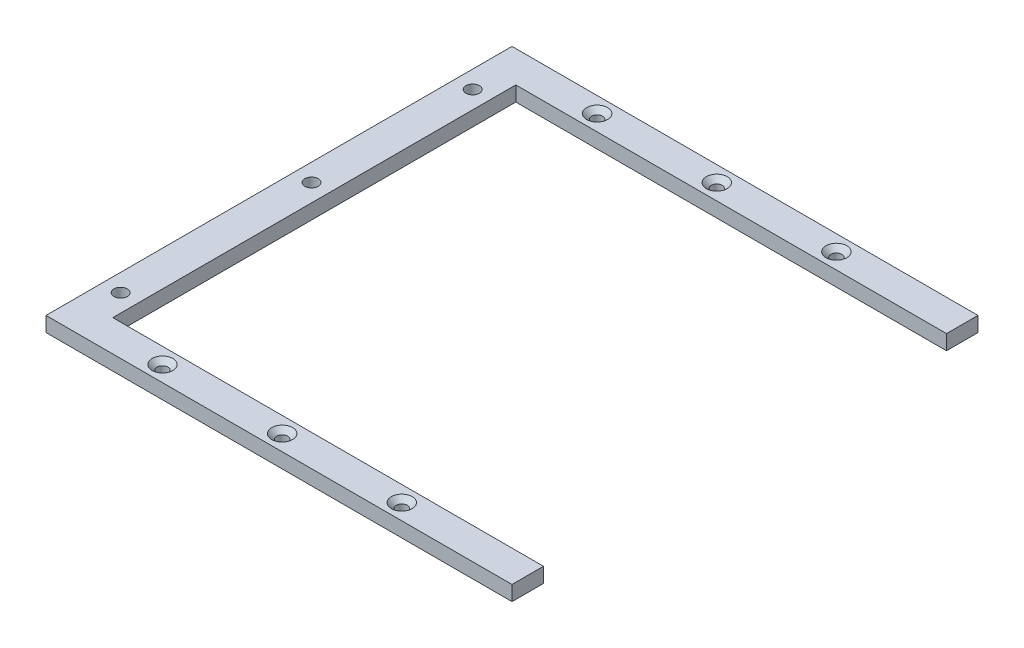
ISO-10303-21;
HEADER;
FILE_DESCRIPTION(('STEP AP214'),'2;1');
FILE_NAME('part.step','',(''),(''),'','','');
FILE_SCHEMA(('AUTOMOTIVE_DESIGN { 1 0 10303 214 1 1 1 1 }'));
ENDSEC;
DATA;
#1=APPLICATION_CONTEXT('core data for automotive mechanical design processes');
#2=APPLICATION_PROTOCOL_DEFINITION('international standard','automotive_design',2000,#1);
#3=PRODUCT_CONTEXT('',#1,'mechanical');
#4=PRODUCT('Part','Part','',(#3));
#5=PRODUCT_RELATED_PRODUCT_CATEGORY('part','',(#4));
#6=PRODUCT_DEFINITION_FORMATION('','',#4);
#7=PRODUCT_DEFINITION_CONTEXT('part definition',#1,'design');
#8=PRODUCT_DEFINITION('design','',#6,#7);
#9=PRODUCT_DEFINITION_SHAPE('','',#8);
#10=(LENGTH_UNIT() NAMED_UNIT(*) SI_UNIT(.MILLI.,.METRE.));
#11=(NAMED_UNIT(*) PLANE_ANGLE_UNIT() SI_UNIT($,.RADIAN.));
#12=(NAMED_UNIT(*) SI_UNIT($,.STERADIAN.) SOLID_ANGLE_UNIT());
#13=UNCERTAINTY_MEASURE_WITH_UNIT(LENGTH_MEASURE(1.E-05),#10,'distance_accuracy_value','');
#14=(GEOMETRIC_REPRESENTATION_CONTEXT(3) GLOBAL_UNCERTAINTY_ASSIGNED_CONTEXT((#13)) GLOBAL_UNIT_ASSIGNED_CONTEXT((#10,
#11,#12)) REPRESENTATION_CONTEXT('',''));
#15=CARTESIAN_POINT('',(0.,0.,0.));
#16=DIRECTION('',(0.,0.,1.));
#17=DIRECTION('',(1.,0.,0.));
#18=AXIS2_PLACEMENT_3D('',#15,#16,#17);
#19=CARTESIAN_POINT('',(0.,3.,0.));
#20=DIRECTION('',(1.,0.,0.));
#21=DIRECTION('',(0.,0.,-1.));
#22=AXIS2_PLACEMENT_3D('',#19,#20,#21);
#23=PLANE('',#22);
#24=DIRECTION('',(0.,0.,1.));
#25=VECTOR('',#24,1.);
#26=CARTESIAN_POINT('',(0.,0.,0.));
#27=LINE('',#26,#25);
#28=CARTESIAN_POINT('',(0.,0.,0.));
#29=VERTEX_POINT('',#28);
#30=CARTESIAN_POINT('',(0.,0.,93.9800000000001));
#31=VERTEX_POINT('',#30);
#32=EDGE_CURVE('E165',#29,#31,#27,.T.);
#33=ORIENTED_EDGE('',*,*,#32,.T.);
#34=DIRECTION('',(0.,-1.,0.));
#35=VECTOR('',#34,1.);
#36=CARTESIAN_POINT('',(0.,3.,93.9800000000001));
#37=LINE('',#36,#35);
#38=CARTESIAN_POINT('',(0.,3.,93.9800000000001));
#39=VERTEX_POINT('',#38);
#40=EDGE_CURVE('E232',#39,#31,#37,.T.);
#41=ORIENTED_EDGE('',*,*,#40,.F.);
#42=DIRECTION('',(0.,0.,1.));
#43=VECTOR('',#42,1.);
#44=CARTESIAN_POINT('',(0.,3.,0.));
#45=LINE('',#44,#43);
#46=CARTESIAN_POINT('',(0.,3.,0.));
#47=VERTEX_POINT('',#46);
#48=EDGE_CURVE('E424',#47,#39,#45,.T.);
#49=ORIENTED_EDGE('',*,*,#48,.F.);
#50=DIRECTION('',(0.,-1.,0.));
#51=VECTOR('',#50,1.);
#52=CARTESIAN_POINT('',(0.,3.,0.));
#53=LINE('',#52,#51);
#54=EDGE_CURVE('E66',#47,#29,#53,.T.);
#55=ORIENTED_EDGE('',*,*,#54,.T.);
#56=EDGE_LOOP('',(#33,#41,#49,#55));
#57=FACE_BOUND('',#56,.T.);
#58=ADVANCED_FACE('F47',(#57),#23,.F.);
#59=CARTESIAN_POINT('',(0.,3.,93.9800000000001));
#60=DIRECTION('',(0.,0.,-1.));
#61=DIRECTION('',(-1.,0.,0.));
#62=AXIS2_PLACEMENT_3D('',#59,#60,#61);
#63=PLANE('',#62);
#64=DIRECTION('',(1.,0.,0.));
#65=VECTOR('',#64,1.);
#66=CARTESIAN_POINT('',(0.,0.,93.9800000000001));
#67=LINE('',#66,#65);
#68=CARTESIAN_POINT('',(93.98,0.,93.9800000000001));
#69=VERTEX_POINT('',#68);
#70=EDGE_CURVE('E168',#31,#69,#67,.T.);
#71=ORIENTED_EDGE('',*,*,#70,.T.);
#72=DIRECTION('',(0.,-1.,0.));
#73=VECTOR('',#72,1.);
#74=CARTESIAN_POINT('',(93.98,3.,93.9800000000001));
#75=LINE('',#74,#73);
#76=CARTESIAN_POINT('',(93.98,3.,93.9800000000001));
#77=VERTEX_POINT('',#76);
#78=EDGE_CURVE('E228',#77,#69,#75,.T.);
#79=ORIENTED_EDGE('',*,*,#78,.F.);
#80=DIRECTION('',(1.,0.,0.));
#81=VECTOR('',#80,1.);
#82=CARTESIAN_POINT('',(0.,3.,93.9800000000001));
#83=LINE('',#82,#81);
#84=EDGE_CURVE('E105',#39,#77,#83,.T.);
#85=ORIENTED_EDGE('',*,*,#84,.F.);
#86=ORIENTED_EDGE('',*,*,#40,.T.);
#87=EDGE_LOOP('',(#71,#79,#85,#86));
#88=FACE_BOUND('',#87,.T.);
#89=ADVANCED_FACE('F296',(#88),#63,.F.);
#90=CARTESIAN_POINT('',(93.98,3.,0.));
#91=DIRECTION('',(-1.,0.,0.));
#92=DIRECTION('',(0.,0.,1.));
#93=AXIS2_PLACEMENT_3D('',#90,#91,#92);
#94=PLANE('',#93);
#95=DIRECTION('',(0.,0.,-1.));
#96=VECTOR('',#95,1.);
#97=CARTESIAN_POINT('',(93.98,0.,0.));
#98=LINE('',#97,#96);
#99=CARTESIAN_POINT('',(93.98,0.,87.6300000000001));
#100=VERTEX_POINT('',#99);
#101=EDGE_CURVE('E171',#69,#100,#98,.T.);
#102=ORIENTED_EDGE('',*,*,#101,.T.);
#103=DIRECTION('',(0.,-1.,0.));
#104=VECTOR('',#103,1.);
#105=CARTESIAN_POINT('',(93.98,3.,87.6300000000001));
#106=LINE('',#105,#104);
#107=CARTESIAN_POINT('',(93.98,3.,87.6300000000001));
#108=VERTEX_POINT('',#107);
#109=EDGE_CURVE('E225',#108,#100,#106,.T.);
#110=ORIENTED_EDGE('',*,*,#109,.F.);
#111=DIRECTION('',(0.,0.,-1.));
#112=VECTOR('',#111,1.);
#113=CARTESIAN_POINT('',(93.98,3.,0.));
#114=LINE('',#113,#112);
#115=EDGE_CURVE('E416',#77,#108,#114,.T.);
#116=ORIENTED_EDGE('',*,*,#115,.F.);
#117=ORIENTED_EDGE('',*,*,#78,.T.);
#118=EDGE_LOOP('',(#102,#110,#116,#117));
#119=FACE_BOUND('',#118,.T.);
#120=ADVANCED_FACE('F301',(#119),#94,.F.);
#121=CARTESIAN_POINT('',(0.,3.,87.6300000000002));
#122=DIRECTION('',(0.,0.,-1.));
#123=DIRECTION('',(-1.,0.,0.));
#124=AXIS2_PLACEMENT_3D('',#121,#122,#123);
#125=PLANE('',#124);
#126=DIRECTION('',(1.,0.,0.));
#127=VECTOR('',#126,1.);
#128=CARTESIAN_POINT('',(0.,0.,87.6300000000002));
#129=LINE('',#128,#127);
#130=CARTESIAN_POINT('',(7.11998400000002,0.,87.6300000000002));
#131=VERTEX_POINT('',#130);
#132=EDGE_CURVE('E175',#131,#100,#129,.T.);
#133=ORIENTED_EDGE('',*,*,#132,.F.);
#134=DIRECTION('',(0.,-1.,0.));
#135=VECTOR('',#134,1.);
#136=CARTESIAN_POINT('',(7.11998400000002,3.,87.6300000000002));
#137=LINE('',#136,#135);
#138=CARTESIAN_POINT('',(7.11998400000002,3.,87.6300000000002));
#139=VERTEX_POINT('',#138);
#140=EDGE_CURVE('E222',#139,#131,#137,.T.);
#141=ORIENTED_EDGE('',*,*,#140,.F.);
#142=DIRECTION('',(1.,0.,0.));
#143=VECTOR('',#142,1.);
#144=CARTESIAN_POINT('',(0.,3.,87.6300000000002));
#145=LINE('',#144,#143);
#146=EDGE_CURVE('E414',#139,#108,#145,.T.);
#147=ORIENTED_EDGE('',*,*,#146,.T.);
#148=ORIENTED_EDGE('',*,*,#109,.T.);
#149=EDGE_LOOP('',(#133,#141,#147,#148));
#150=FACE_BOUND('',#149,.T.);
#151=ADVANCED_FACE('F398',(#150),#125,.T.);
#152=CARTESIAN_POINT('',(7.11998399999999,3.,0.));
#153=DIRECTION('',(-1.,0.,0.));
#154=DIRECTION('',(0.,0.,1.));
#155=AXIS2_PLACEMENT_3D('',#152,#153,#154);
#156=PLANE('',#155);
#157=DIRECTION('',(0.,0.,-1.));
#158=VECTOR('',#157,1.);
#159=CARTESIAN_POINT('',(7.11998399999999,0.,0.));
#160=LINE('',#159,#158);
#161=CARTESIAN_POINT('',(7.11998399999999,0.,6.34999999999995));
#162=VERTEX_POINT('',#161);
#163=EDGE_CURVE('E179',#131,#162,#160,.T.);
#164=ORIENTED_EDGE('',*,*,#163,.T.);
#165=DIRECTION('',(0.,-1.,0.));
#166=VECTOR('',#165,1.);
#167=CARTESIAN_POINT('',(7.11998399999999,3.,6.34999999999995));
#168=LINE('',#167,#166);
#169=CARTESIAN_POINT('',(7.11998399999999,3.,6.34999999999995));
#170=VERTEX_POINT('',#169);
#171=EDGE_CURVE('E143',#170,#162,#168,.T.);
#172=ORIENTED_EDGE('',*,*,#171,.F.);
#173=DIRECTION('',(0.,0.,-1.));
#174=VECTOR('',#173,1.);
#175=CARTESIAN_POINT('',(7.11998399999999,3.,0.));
#176=LINE('',#175,#174);
#177=EDGE_CURVE('E129',#139,#170,#176,.T.);
#178=ORIENTED_EDGE('',*,*,#177,.F.);
#179=ORIENTED_EDGE('',*,*,#140,.T.);
#180=EDGE_LOOP('',(#164,#172,#178,#179));
#181=FACE_BOUND('',#180,.T.);
#182=ADVANCED_FACE('F395',(#181),#156,.F.);
#183=CARTESIAN_POINT('',(0.,3.,6.34999999999995));
#184=DIRECTION('',(0.,0.,-1.));
#185=DIRECTION('',(-1.,0.,0.));
#186=AXIS2_PLACEMENT_3D('',#183,#184,#185);
#187=PLANE('',#186);
#188=DIRECTION('',(1.,0.,0.));
#189=VECTOR('',#188,1.);
#190=CARTESIAN_POINT('',(0.,0.,6.34999999999995));
#191=LINE('',#190,#189);
#192=CARTESIAN_POINT('',(93.98,0.,6.34999999999995));
#193=VERTEX_POINT('',#192);
#194=EDGE_CURVE('E139',#162,#193,#191,.T.);
#195=ORIENTED_EDGE('',*,*,#194,.T.);
#196=DIRECTION('',(0.,-1.,0.));
#197=VECTOR('',#196,1.);
#198=CARTESIAN_POINT('',(93.98,3.,6.34999999999995));
#199=LINE('',#198,#197);
#200=CARTESIAN_POINT('',(93.98,3.,6.34999999999995));
#201=VERTEX_POINT('',#200);
#202=EDGE_CURVE('E136',#201,#193,#199,.T.);
#203=ORIENTED_EDGE('',*,*,#202,.F.);
#204=DIRECTION('',(1.,0.,0.));
#205=VECTOR('',#204,1.);
#206=CARTESIAN_POINT('',(0.,3.,6.34999999999995));
#207=LINE('',#206,#205);
#208=EDGE_CURVE('E121',#170,#201,#207,.T.);
#209=ORIENTED_EDGE('',*,*,#208,.F.);
#210=ORIENTED_EDGE('',*,*,#171,.T.);
#211=EDGE_LOOP('',(#195,#203,#209,#210));
#212=FACE_BOUND('',#211,.T.);
#213=ADVANCED_FACE('F137',(#212),#187,.F.);
#214=CARTESIAN_POINT('',(93.98,3.,0.));
#215=DIRECTION('',(1.,0.,0.));
#216=DIRECTION('',(0.,0.,-1.));
#217=AXIS2_PLACEMENT_3D('',#214,#215,#216);
#218=PLANE('',#217);
#219=DIRECTION('',(0.,0.,1.));
#220=VECTOR('',#219,1.);
#221=CARTESIAN_POINT('',(93.98,0.,0.));
#222=LINE('',#221,#220);
#223=CARTESIAN_POINT('',(93.98,0.,0.));
#224=VERTEX_POINT('',#223);
#225=EDGE_CURVE('E184',#224,#193,#222,.T.);
#226=ORIENTED_EDGE('',*,*,#225,.F.);
#227=DIRECTION('',(0.,-1.,0.));
#228=VECTOR('',#227,1.);
#229=CARTESIAN_POINT('',(93.98,3.,0.));
#230=LINE('',#229,#228);
#231=CARTESIAN_POINT('',(93.98,3.,0.));
#232=VERTEX_POINT('',#231);
#233=EDGE_CURVE('E92',#232,#224,#230,.T.);
#234=ORIENTED_EDGE('',*,*,#233,.F.);
#235=DIRECTION('',(0.,0.,1.));
#236=VECTOR('',#235,1.);
#237=CARTESIAN_POINT('',(93.98,3.,0.));
#238=LINE('',#237,#236);
#239=EDGE_CURVE('E126',#232,#201,#238,.T.);
#240=ORIENTED_EDGE('',*,*,#239,.T.);
#241=ORIENTED_EDGE('',*,*,#202,.T.);
#242=EDGE_LOOP('',(#226,#234,#240,#241));
#243=FACE_BOUND('',#242,.T.);
#244=ADVANCED_FACE('F145',(#243),#218,.T.);
#245=CARTESIAN_POINT('',(44.45,3.,90.8050000000001));
#246=DIRECTION('',(0.,-1.,0.));
#247=DIRECTION('',(0.,0.,-1.));
#248=AXIS2_PLACEMENT_3D('',#245,#246,#247);
#249=CYLINDRICAL_SURFACE('',#248,1.10000000000001);
#250=CARTESIAN_POINT('',(44.45,1.99999999999997,90.8050000000001));
#251=DIRECTION('',(0.,1.,0.));
#252=DIRECTION('',(0.,0.,1.));
#253=AXIS2_PLACEMENT_3D('',#250,#251,#252);
#254=CIRCLE('',#253,1.10000000000001);
#255=CARTESIAN_POINT('',(44.45,1.99999999999997,91.9050000000001));
#256=VERTEX_POINT('',#255);
#257=EDGE_CURVE('E263',#256,#256,#254,.T.);
#258=ORIENTED_EDGE('',*,*,#257,.T.);
#259=EDGE_LOOP('',(#258));
#260=FACE_BOUND('',#259,.T.);
#261=CARTESIAN_POINT('',(44.45,0.,90.8050000000001));
#262=DIRECTION('',(0.,1.,0.));
#263=DIRECTION('',(0.,0.,1.));
#264=AXIS2_PLACEMENT_3D('',#261,#262,#263);
#265=CIRCLE('',#264,1.10000000000001);
#266=CARTESIAN_POINT('',(44.45,0.,91.9050000000001));
#267=VERTEX_POINT('',#266);
#268=EDGE_CURVE('E207',#267,#267,#265,.T.);
#269=ORIENTED_EDGE('',*,*,#268,.F.);
#270=EDGE_LOOP('',(#269));
#271=FACE_BOUND('',#270,.T.);
#272=ADVANCED_FACE('F356',(#260,#271),#249,.F.);
#273=CARTESIAN_POINT('',(68.58,3.,90.8050000000001));
#274=DIRECTION('',(0.,-1.,0.));
#275=DIRECTION('',(0.,0.,-1.));
#276=AXIS2_PLACEMENT_3D('',#273,#274,#275);
#277=CYLINDRICAL_SURFACE('',#276,1.10000000000001);
#278=CARTESIAN_POINT('',(68.58,1.99999999999997,90.8050000000001));
#279=DIRECTION('',(0.,1.,0.));
#280=DIRECTION('',(0.,0.,1.));
#281=AXIS2_PLACEMENT_3D('',#278,#279,#280);
#282=CIRCLE('',#281,1.10000000000001);
#283=CARTESIAN_POINT('',(68.58,1.99999999999997,91.9050000000001));
#284=VERTEX_POINT('',#283);
#285=EDGE_CURVE('E267',#284,#284,#282,.T.);
#286=ORIENTED_EDGE('',*,*,#285,.T.);
#287=EDGE_LOOP('',(#286));
#288=FACE_BOUND('',#287,.T.);
#289=CARTESIAN_POINT('',(68.58,0.,90.8050000000001));
#290=DIRECTION('',(0.,1.,0.));
#291=DIRECTION('',(0.,0.,1.));
#292=AXIS2_PLACEMENT_3D('',#289,#290,#291);
#293=CIRCLE('',#292,1.10000000000001);
#294=CARTESIAN_POINT('',(68.58,0.,91.9050000000001));
#295=VERTEX_POINT('',#294);
#296=EDGE_CURVE('E203',#295,#295,#293,.T.);
#297=ORIENTED_EDGE('',*,*,#296,.F.);
#298=EDGE_LOOP('',(#297));
#299=FACE_BOUND('',#298,.T.);
#300=ADVANCED_FACE('F352',(#288,#299),#277,.F.);
#301=CARTESIAN_POINT('',(20.32,3.,3.155));
#302=DIRECTION('',(0.,-1.,0.));
#303=DIRECTION('',(0.,0.,-1.));
#304=AXIS2_PLACEMENT_3D('',#301,#302,#303);
#305=CYLINDRICAL_SURFACE('',#304,1.1);
#306=CARTESIAN_POINT('',(20.32,1.99999999999996,3.155));
#307=DIRECTION('',(0.,1.,0.));
#308=DIRECTION('',(0.,0.,1.));
#309=AXIS2_PLACEMENT_3D('',#306,#307,#308);
#310=CIRCLE('',#309,1.1);
#311=CARTESIAN_POINT('',(20.32,1.99999999999996,4.255));
#312=VERTEX_POINT('',#311);
#313=EDGE_CURVE('E11',#312,#312,#310,.T.);
#314=ORIENTED_EDGE('',*,*,#313,.T.);
#315=EDGE_LOOP('',(#314));
#316=FACE_BOUND('',#315,.T.);
#317=CARTESIAN_POINT('',(20.32,0.,3.155));
#318=DIRECTION('',(0.,1.,0.));
#319=DIRECTION('',(0.,0.,1.));
#320=AXIS2_PLACEMENT_3D('',#317,#318,#319);
#321=CIRCLE('',#320,1.1);
#322=CARTESIAN_POINT('',(20.32,0.,4.255));
#323=VERTEX_POINT('',#322);
#324=EDGE_CURVE('E199',#323,#323,#321,.T.);
#325=ORIENTED_EDGE('',*,*,#324,.F.);
#326=EDGE_LOOP('',(#325));
#327=FACE_BOUND('',#326,.T.);
#328=ADVANCED_FACE('F355',(#316,#327),#305,.F.);
#329=CARTESIAN_POINT('',(44.45,3.,3.155));
#330=DIRECTION('',(0.,-1.,0.));
#331=DIRECTION('',(0.,0.,-1.));
#332=AXIS2_PLACEMENT_3D('',#329,#330,#331);
#333=CYLINDRICAL_SURFACE('',#332,1.1);
#334=CARTESIAN_POINT('',(44.45,1.99999999999996,3.155));
#335=DIRECTION('',(0.,1.,0.));
#336=DIRECTION('',(0.,0.,1.));
#337=AXIS2_PLACEMENT_3D('',#334,#335,#336);
#338=CIRCLE('',#337,1.1);
#339=CARTESIAN_POINT('',(44.45,1.99999999999996,4.255));
#340=VERTEX_POINT('',#339);
#341=EDGE_CURVE('E58',#340,#340,#338,.T.);
#342=ORIENTED_EDGE('',*,*,#341,.T.);
#343=EDGE_LOOP('',(#342));
#344=FACE_BOUND('',#343,.T.);
#345=CARTESIAN_POINT('',(44.45,0.,3.155));
#346=DIRECTION('',(0.,1.,0.));
#347=DIRECTION('',(0.,0.,1.));
#348=AXIS2_PLACEMENT_3D('',#345,#346,#347);
#349=CIRCLE('',#348,1.1);
#350=CARTESIAN_POINT('',(44.45,0.,4.255));
#351=VERTEX_POINT('',#350);
#352=EDGE_CURVE('E195',#351,#351,#349,.T.);
#353=ORIENTED_EDGE('',*,*,#352,.F.);
#354=EDGE_LOOP('',(#353));
#355=FACE_BOUND('',#354,.T.);
#356=ADVANCED_FACE('F278',(#344,#355),#333,.F.);
#357=CARTESIAN_POINT('',(68.58,3.,3.155));
#358=DIRECTION('',(0.,-1.,0.));
#359=DIRECTION('',(0.,0.,-1.));
#360=AXIS2_PLACEMENT_3D('',#357,#358,#359);
#361=CYLINDRICAL_SURFACE('',#360,1.10000000000001);
#362=CARTESIAN_POINT('',(68.58,1.99999999999997,3.155));
#363=DIRECTION('',(0.,1.,0.));
#364=DIRECTION('',(0.,0.,1.));
#365=AXIS2_PLACEMENT_3D('',#362,#363,#364);
#366=CIRCLE('',#365,1.10000000000001);
#367=CARTESIAN_POINT('',(68.58,1.99999999999997,4.25500000000001));
#368=VERTEX_POINT('',#367);
#369=EDGE_CURVE('E271',#368,#368,#366,.T.);
#370=ORIENTED_EDGE('',*,*,#369,.T.);
#371=EDGE_LOOP('',(#370));
#372=FACE_BOUND('',#371,.T.);
#373=CARTESIAN_POINT('',(68.58,0.,3.155));
#374=DIRECTION('',(0.,1.,0.));
#375=DIRECTION('',(0.,0.,1.));
#376=AXIS2_PLACEMENT_3D('',#373,#374,#375);
#377=CIRCLE('',#376,1.10000000000001);
#378=CARTESIAN_POINT('',(68.58,0.,4.25500000000001));
#379=VERTEX_POINT('',#378);
#380=EDGE_CURVE('E191',#379,#379,#377,.T.);
#381=ORIENTED_EDGE('',*,*,#380,.F.);
#382=EDGE_LOOP('',(#381));
#383=FACE_BOUND('',#382,.T.);
#384=ADVANCED_FACE('F385',(#372,#383),#361,.F.);
#385=CARTESIAN_POINT('',(0.,3.,0.));
#386=DIRECTION('',(0.,0.,-1.));
#387=DIRECTION('',(-1.,0.,0.));
#388=AXIS2_PLACEMENT_3D('',#385,#386,#387);
#389=PLANE('',#388);
#390=DIRECTION('',(1.,0.,0.));
#391=VECTOR('',#390,1.);
#392=CARTESIAN_POINT('',(0.,0.,0.));
#393=LINE('',#392,#391);
#394=EDGE_CURVE('E187',#29,#224,#393,.T.);
#395=ORIENTED_EDGE('',*,*,#394,.F.);
#396=ORIENTED_EDGE('',*,*,#54,.F.);
#397=DIRECTION('',(1.,0.,0.));
#398=VECTOR('',#397,1.);
#399=CARTESIAN_POINT('',(0.,3.,0.));
#400=LINE('',#399,#398);
#401=EDGE_CURVE('E147',#47,#232,#400,.T.);
#402=ORIENTED_EDGE('',*,*,#401,.T.);
#403=ORIENTED_EDGE('',*,*,#233,.T.);
#404=EDGE_LOOP('',(#395,#396,#402,#403));
#405=FACE_BOUND('',#404,.T.);
#406=ADVANCED_FACE('F309',(#405),#389,.T.);
#407=CARTESIAN_POINT('',(3.55999200000001,3.,82.490012));
#408=DIRECTION('',(0.,-1.,0.));
#409=DIRECTION('',(0.,0.,-1.));
#410=AXIS2_PLACEMENT_3D('',#407,#408,#409);
#411=CYLINDRICAL_SURFACE('',#410,1.35);
#412=CARTESIAN_POINT('',(3.55999200000001,3.,82.490012));
#413=DIRECTION('',(0.,1.,0.));
#414=DIRECTION('',(0.,0.,1.));
#415=AXIS2_PLACEMENT_3D('',#412,#413,#414);
#416=CIRCLE('',#415,1.35);
#417=CARTESIAN_POINT('',(3.55999200000001,3.,83.840012));
#418=VERTEX_POINT('',#417);
#419=EDGE_CURVE('E427',#418,#418,#416,.T.);
#420=ORIENTED_EDGE('',*,*,#419,.T.);
#421=EDGE_LOOP('',(#420));
#422=FACE_BOUND('',#421,.T.);
#423=CARTESIAN_POINT('',(3.55999200000001,0.,82.490012));
#424=DIRECTION('',(0.,1.,0.));
#425=DIRECTION('',(0.,0.,1.));
#426=AXIS2_PLACEMENT_3D('',#423,#424,#425);
#427=CIRCLE('',#426,1.35);
#428=CARTESIAN_POINT('',(3.55999200000001,0.,83.840012));
#429=VERTEX_POINT('',#428);
#430=EDGE_CURVE('E161',#429,#429,#427,.T.);
#431=ORIENTED_EDGE('',*,*,#430,.F.);
#432=EDGE_LOOP('',(#431));
#433=FACE_BOUND('',#432,.T.);
#434=ADVANCED_FACE('F305',(#422,#433),#411,.F.);
#435=CARTESIAN_POINT('',(3.559992,3.,43.990012));
#436=DIRECTION('',(0.,-1.,0.));
#437=DIRECTION('',(0.,0.,-1.));
#438=AXIS2_PLACEMENT_3D('',#435,#436,#437);
#439=CYLINDRICAL_SURFACE('',#438,1.35);
#440=CARTESIAN_POINT('',(3.559992,3.,43.990012));
#441=DIRECTION('',(0.,1.,0.));
#442=DIRECTION('',(0.,0.,1.));
#443=AXIS2_PLACEMENT_3D('',#440,#441,#442);
#444=CIRCLE('',#443,1.35);
#445=CARTESIAN_POINT('',(3.559992,3.,45.340012));
#446=VERTEX_POINT('',#445);
#447=EDGE_CURVE('E431',#446,#446,#444,.T.);
#448=ORIENTED_EDGE('',*,*,#447,.T.);
#449=EDGE_LOOP('',(#448));
#450=FACE_BOUND('',#449,.T.);
#451=CARTESIAN_POINT('',(3.559992,0.,43.990012));
#452=DIRECTION('',(0.,1.,0.));
#453=DIRECTION('',(0.,0.,1.));
#454=AXIS2_PLACEMENT_3D('',#451,#452,#453);
#455=CIRCLE('',#454,1.35);
#456=CARTESIAN_POINT('',(3.559992,0.,45.340012));
#457=VERTEX_POINT('',#456);
#458=EDGE_CURVE('E157',#457,#457,#455,.T.);
#459=ORIENTED_EDGE('',*,*,#458,.F.);
#460=EDGE_LOOP('',(#459));
#461=FACE_BOUND('',#460,.T.);
#462=ADVANCED_FACE('F308',(#450,#461),#439,.F.);
#463=CARTESIAN_POINT('',(3.559992,3.,11.490012));
#464=DIRECTION('',(0.,-1.,0.));
#465=DIRECTION('',(0.,0.,-1.));
#466=AXIS2_PLACEMENT_3D('',#463,#464,#465);
#467=CYLINDRICAL_SURFACE('',#466,1.35);
#468=CARTESIAN_POINT('',(3.559992,3.,11.490012));
#469=DIRECTION('',(0.,1.,0.));
#470=DIRECTION('',(0.,0.,1.));
#471=AXIS2_PLACEMENT_3D('',#468,#469,#470);
#472=CIRCLE('',#471,1.35);
#473=CARTESIAN_POINT('',(3.559992,3.,12.840012));
#474=VERTEX_POINT('',#473);
#475=EDGE_CURVE('E215',#474,#474,#472,.T.);
#476=ORIENTED_EDGE('',*,*,#475,.T.);
#477=EDGE_LOOP('',(#476));
#478=FACE_BOUND('',#477,.T.);
#479=CARTESIAN_POINT('',(3.559992,0.,11.490012));
#480=DIRECTION('',(0.,1.,0.));
#481=DIRECTION('',(0.,0.,1.));
#482=AXIS2_PLACEMENT_3D('',#479,#480,#481);
#483=CIRCLE('',#482,1.35);
#484=CARTESIAN_POINT('',(3.559992,0.,12.840012));
#485=VERTEX_POINT('',#484);
#486=EDGE_CURVE('E153',#485,#485,#483,.T.);
#487=ORIENTED_EDGE('',*,*,#486,.F.);
#488=EDGE_LOOP('',(#487));
#489=FACE_BOUND('',#488,.T.);
#490=ADVANCED_FACE('F313',(#478,#489),#467,.F.);
#491=CARTESIAN_POINT('',(20.32,3.,90.8050000000001));
#492=DIRECTION('',(0.,-1.,0.));
#493=DIRECTION('',(0.,0.,-1.));
#494=AXIS2_PLACEMENT_3D('',#491,#492,#493);
#495=CYLINDRICAL_SURFACE('',#494,1.1);
#496=CARTESIAN_POINT('',(20.32,1.99999999999996,90.8050000000001));
#497=DIRECTION('',(0.,1.,0.));
#498=DIRECTION('',(0.,0.,1.));
#499=AXIS2_PLACEMENT_3D('',#496,#497,#498);
#500=CIRCLE('',#499,1.1);
#501=CARTESIAN_POINT('',(20.32,1.99999999999996,91.9050000000001));
#502=VERTEX_POINT('',#501);
#503=EDGE_CURVE('E235',#502,#502,#500,.T.);
#504=ORIENTED_EDGE('',*,*,#503,.T.);
#505=EDGE_LOOP('',(#504));
#506=FACE_BOUND('',#505,.T.);
#507=CARTESIAN_POINT('',(20.32,0.,90.8050000000001));
#508=DIRECTION('',(0.,1.,0.));
#509=DIRECTION('',(0.,0.,1.));
#510=AXIS2_PLACEMENT_3D('',#507,#508,#509);
#511=CIRCLE('',#510,1.1);
#512=CARTESIAN_POINT('',(20.32,0.,91.9050000000001));
#513=VERTEX_POINT('',#512);
#514=EDGE_CURVE('E211',#513,#513,#511,.T.);
#515=ORIENTED_EDGE('',*,*,#514,.F.);
#516=EDGE_LOOP('',(#515));
#517=FACE_BOUND('',#516,.T.);
#518=ADVANCED_FACE('F317',(#506,#517),#495,.F.);
#519=CARTESIAN_POINT('',(0.,3.,0.));
#520=DIRECTION('',(0.,1.,0.));
#521=DIRECTION('',(0.,0.,1.));
#522=AXIS2_PLACEMENT_3D('',#519,#520,#521);
#523=PLANE('',#522);
#524=CARTESIAN_POINT('',(20.32,3.,90.8050000000001));
#525=DIRECTION('',(0.,1.,0.));
#526=DIRECTION('',(0.,0.,1.));
#527=AXIS2_PLACEMENT_3D('',#524,#525,#526);
#528=CIRCLE('',#527,2.10000000000005);
#529=CARTESIAN_POINT('',(20.32,3.,92.9050000000002));
#530=VERTEX_POINT('',#529);
#531=EDGE_CURVE('E259',#530,#530,#528,.F.);
#532=ORIENTED_EDGE('',*,*,#531,.T.);
#533=EDGE_LOOP('',(#532));
#534=FACE_BOUND('',#533,.T.);
#535=CARTESIAN_POINT('',(44.45,3.,90.8050000000001));
#536=DIRECTION('',(0.,1.,0.));
#537=DIRECTION('',(0.,0.,1.));
#538=AXIS2_PLACEMENT_3D('',#535,#536,#537);
#539=CIRCLE('',#538,2.10000000000005);
#540=CARTESIAN_POINT('',(44.45,3.,92.9050000000002));
#541=VERTEX_POINT('',#540);
#542=EDGE_CURVE('E255',#541,#541,#539,.F.);
#543=ORIENTED_EDGE('',*,*,#542,.T.);
#544=EDGE_LOOP('',(#543));
#545=FACE_BOUND('',#544,.T.);
#546=CARTESIAN_POINT('',(68.58,3.,90.8050000000001));
#547=DIRECTION('',(0.,1.,0.));
#548=DIRECTION('',(0.,0.,1.));
#549=AXIS2_PLACEMENT_3D('',#546,#547,#548);
#550=CIRCLE('',#549,2.10000000000005);
#551=CARTESIAN_POINT('',(68.58,3.,92.9050000000002));
#552=VERTEX_POINT('',#551);
#553=EDGE_CURVE('E251',#552,#552,#550,.F.);
#554=ORIENTED_EDGE('',*,*,#553,.T.);
#555=EDGE_LOOP('',(#554));
#556=FACE_BOUND('',#555,.T.);
#557=CARTESIAN_POINT('',(68.58,3.,3.155));
#558=DIRECTION('',(0.,1.,0.));
#559=DIRECTION('',(0.,0.,1.));
#560=AXIS2_PLACEMENT_3D('',#557,#558,#559);
#561=CIRCLE('',#560,2.10000000000005);
#562=CARTESIAN_POINT('',(68.58,3.,5.25500000000005));
#563=VERTEX_POINT('',#562);
#564=EDGE_CURVE('E247',#563,#563,#561,.F.);
#565=ORIENTED_EDGE('',*,*,#564,.T.);
#566=EDGE_LOOP('',(#565));
#567=FACE_BOUND('',#566,.T.);
#568=CARTESIAN_POINT('',(44.45,3.,3.155));
#569=DIRECTION('',(0.,1.,0.));
#570=DIRECTION('',(0.,0.,1.));
#571=AXIS2_PLACEMENT_3D('',#568,#569,#570);
#572=CIRCLE('',#571,2.10000000000005);
#573=CARTESIAN_POINT('',(44.45,3.,5.25500000000005));
#574=VERTEX_POINT('',#573);
#575=EDGE_CURVE('E243',#574,#574,#572,.F.);
#576=ORIENTED_EDGE('',*,*,#575,.T.);
#577=EDGE_LOOP('',(#576));
#578=FACE_BOUND('',#577,.T.);
#579=CARTESIAN_POINT('',(20.32,3.,3.155));
#580=DIRECTION('',(0.,1.,0.));
#581=DIRECTION('',(0.,0.,1.));
#582=AXIS2_PLACEMENT_3D('',#579,#580,#581);
#583=CIRCLE('',#582,2.10000000000005);
#584=CARTESIAN_POINT('',(20.32,3.,5.25500000000005));
#585=VERTEX_POINT('',#584);
#586=EDGE_CURVE('E239',#585,#585,#583,.F.);
#587=ORIENTED_EDGE('',*,*,#586,.T.);
#588=EDGE_LOOP('',(#587));
#589=FACE_BOUND('',#588,.T.);
#590=ORIENTED_EDGE('',*,*,#475,.F.);
#591=EDGE_LOOP('',(#590));
#592=FACE_BOUND('',#591,.T.);
#593=ORIENTED_EDGE('',*,*,#447,.F.);
#594=EDGE_LOOP('',(#593));
#595=FACE_BOUND('',#594,.T.);
#596=ORIENTED_EDGE('',*,*,#419,.F.);
#597=EDGE_LOOP('',(#596));
#598=FACE_BOUND('',#597,.T.);
#599=ORIENTED_EDGE('',*,*,#48,.T.);
#600=ORIENTED_EDGE('',*,*,#84,.T.);
#601=ORIENTED_EDGE('',*,*,#115,.T.);
#602=ORIENTED_EDGE('',*,*,#146,.F.);
#603=ORIENTED_EDGE('',*,*,#177,.T.);
#604=ORIENTED_EDGE('',*,*,#208,.T.);
#605=ORIENTED_EDGE('',*,*,#239,.F.);
#606=ORIENTED_EDGE('',*,*,#401,.F.);
#607=EDGE_LOOP('',(#599,#600,#601,#602,#603,#604,#605,#606));
#608=FACE_BOUND('',#607,.T.);
#609=ADVANCED_FACE('F123',(#534,#545,#556,#567,#578,#589,#592,#595,#598,#608),#523,.T.);
#610=CARTESIAN_POINT('',(0.,0.,0.));
#611=DIRECTION('',(0.,1.,0.));
#612=DIRECTION('',(0.,0.,1.));
#613=AXIS2_PLACEMENT_3D('',#610,#611,#612);
#614=PLANE('',#613);
#615=ORIENTED_EDGE('',*,*,#486,.T.);
#616=EDGE_LOOP('',(#615));
#617=FACE_BOUND('',#616,.T.);
#618=ORIENTED_EDGE('',*,*,#458,.T.);
#619=EDGE_LOOP('',(#618));
#620=FACE_BOUND('',#619,.T.);
#621=ORIENTED_EDGE('',*,*,#430,.T.);
#622=EDGE_LOOP('',(#621));
#623=FACE_BOUND('',#622,.T.);
#624=ORIENTED_EDGE('',*,*,#32,.F.);
#625=ORIENTED_EDGE('',*,*,#394,.T.);
#626=ORIENTED_EDGE('',*,*,#225,.T.);
#627=ORIENTED_EDGE('',*,*,#194,.F.);
#628=ORIENTED_EDGE('',*,*,#163,.F.);
#629=ORIENTED_EDGE('',*,*,#132,.T.);
#630=ORIENTED_EDGE('',*,*,#101,.F.);
#631=ORIENTED_EDGE('',*,*,#70,.F.);
#632=EDGE_LOOP('',(#624,#625,#626,#627,#628,#629,#630,#631));
#633=FACE_BOUND('',#632,.T.);
#634=ORIENTED_EDGE('',*,*,#380,.T.);
#635=EDGE_LOOP('',(#634));
#636=FACE_BOUND('',#635,.T.);
#637=ORIENTED_EDGE('',*,*,#352,.T.);
#638=EDGE_LOOP('',(#637));
#639=FACE_BOUND('',#638,.T.);
#640=ORIENTED_EDGE('',*,*,#324,.T.);
#641=EDGE_LOOP('',(#640));
#642=FACE_BOUND('',#641,.T.);
#643=ORIENTED_EDGE('',*,*,#296,.T.);
#644=EDGE_LOOP('',(#643));
#645=FACE_BOUND('',#644,.T.);
#646=ORIENTED_EDGE('',*,*,#268,.T.);
#647=EDGE_LOOP('',(#646));
#648=FACE_BOUND('',#647,.T.);
#649=ORIENTED_EDGE('',*,*,#514,.T.);
#650=EDGE_LOOP('',(#649));
#651=FACE_BOUND('',#650,.T.);
#652=ADVANCED_FACE('F327',(#617,#620,#623,#633,#636,#639,#642,#645,#648,#651),#614,.F.);
#653=CARTESIAN_POINT('',(20.32,1.99999999999996,90.8050000000001));
#654=DIRECTION('',(0.,1.,0.));
#655=DIRECTION('',(0.,0.,1.));
#656=AXIS2_PLACEMENT_3D('',#653,#654,#655);
#657=CONICAL_SURFACE('',#656,1.1,0.785398163397453);
#658=ORIENTED_EDGE('',*,*,#531,.F.);
#659=EDGE_LOOP('',(#658));
#660=FACE_BOUND('',#659,.T.);
#661=ORIENTED_EDGE('',*,*,#503,.F.);
#662=EDGE_LOOP('',(#661));
#663=FACE_BOUND('',#662,.T.);
#664=ADVANCED_FACE('F320',(#660,#663),#657,.F.);
#665=CARTESIAN_POINT('',(44.45,1.99999999999997,90.8050000000001));
#666=DIRECTION('',(0.,1.,0.));
#667=DIRECTION('',(0.,0.,1.));
#668=AXIS2_PLACEMENT_3D('',#665,#666,#667);
#669=CONICAL_SURFACE('',#668,1.10000000000001,0.785398163397453);
#670=ORIENTED_EDGE('',*,*,#542,.F.);
#671=EDGE_LOOP('',(#670));
#672=FACE_BOUND('',#671,.T.);
#673=ORIENTED_EDGE('',*,*,#257,.F.);
#674=EDGE_LOOP('',(#673));
#675=FACE_BOUND('',#674,.T.);
#676=ADVANCED_FACE('F326',(#672,#675),#669,.F.);
#677=CARTESIAN_POINT('',(68.58,1.99999999999997,90.8050000000001));
#678=DIRECTION('',(0.,1.,0.));
#679=DIRECTION('',(0.,0.,1.));
#680=AXIS2_PLACEMENT_3D('',#677,#678,#679);
#681=CONICAL_SURFACE('',#680,1.10000000000001,0.785398163397453);
#682=ORIENTED_EDGE('',*,*,#553,.F.);
#683=EDGE_LOOP('',(#682));
#684=FACE_BOUND('',#683,.T.);
#685=ORIENTED_EDGE('',*,*,#285,.F.);
#686=EDGE_LOOP('',(#685));
#687=FACE_BOUND('',#686,.T.);
#688=ADVANCED_FACE('F290',(#684,#687),#681,.F.);
#689=CARTESIAN_POINT('',(68.58,1.99999999999997,3.155));
#690=DIRECTION('',(0.,1.,0.));
#691=DIRECTION('',(0.,0.,1.));
#692=AXIS2_PLACEMENT_3D('',#689,#690,#691);
#693=CONICAL_SURFACE('',#692,1.10000000000001,0.785398163397453);
#694=ORIENTED_EDGE('',*,*,#564,.F.);
#695=EDGE_LOOP('',(#694));
#696=FACE_BOUND('',#695,.T.);
#697=ORIENTED_EDGE('',*,*,#369,.F.);
#698=EDGE_LOOP('',(#697));
#699=FACE_BOUND('',#698,.T.);
#700=ADVANCED_FACE('F283',(#696,#699),#693,.F.);
#701=CARTESIAN_POINT('',(44.45,1.99999999999996,3.155));
#702=DIRECTION('',(0.,1.,0.));
#703=DIRECTION('',(0.,0.,1.));
#704=AXIS2_PLACEMENT_3D('',#701,#702,#703);
#705=CONICAL_SURFACE('',#704,1.1,0.785398163397453);
#706=ORIENTED_EDGE('',*,*,#575,.F.);
#707=EDGE_LOOP('',(#706));
#708=FACE_BOUND('',#707,.T.);
#709=ORIENTED_EDGE('',*,*,#341,.F.);
#710=EDGE_LOOP('',(#709));
#711=FACE_BOUND('',#710,.T.);
#712=ADVANCED_FACE('F281',(#708,#711),#705,.F.);
#713=CARTESIAN_POINT('',(20.32,1.99999999999996,3.155));
#714=DIRECTION('',(0.,1.,0.));
#715=DIRECTION('',(0.,0.,1.));
#716=AXIS2_PLACEMENT_3D('',#713,#714,#715);
#717=CONICAL_SURFACE('',#716,1.1,0.785398163397453);
#718=ORIENTED_EDGE('',*,*,#586,.F.);
#719=EDGE_LOOP('',(#718));
#720=FACE_BOUND('',#719,.T.);
#721=ORIENTED_EDGE('',*,*,#313,.F.);
#722=EDGE_LOOP('',(#721));
#723=FACE_BOUND('',#722,.T.);
#724=ADVANCED_FACE('F50',(#720,#723),#717,.F.);
#725=CLOSED_SHELL('',(#58,#89,#120,#151,#182,#213,#244,#272,#300,#328,#356,#384,#406,#434,#462,
#490,#518,#609,#652,#664,#676,#688,#700,#712,#724));
#726=MANIFOLD_SOLID_BREP('B2',#725);
#727=ADVANCED_BREP_SHAPE_REPRESENTATION('',(#18,#726),#14);
#728=SHAPE_DEFINITION_REPRESENTATION(#9,#727);
ENDSEC;
END-ISO-10303-21;
